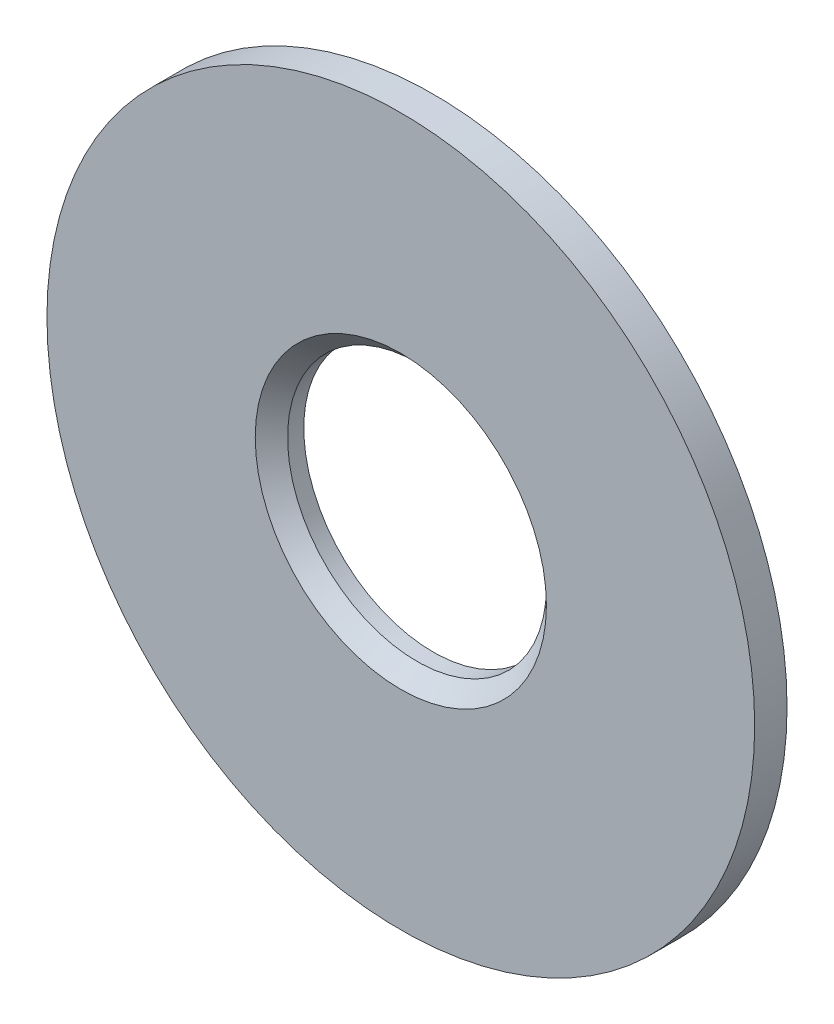
ISO-10303-21;
HEADER;
FILE_DESCRIPTION(('STEP AP214'),'2;1');
FILE_NAME('part.step','',(''),(''),'','','');
FILE_SCHEMA(('AUTOMOTIVE_DESIGN { 1 0 10303 214 1 1 1 1 }'));
ENDSEC;
DATA;
#1=APPLICATION_CONTEXT('core data for automotive mechanical design processes');
#2=APPLICATION_PROTOCOL_DEFINITION('international standard','automotive_design',2000,#1);
#3=PRODUCT_CONTEXT('',#1,'mechanical');
#4=PRODUCT('Part','Part','',(#3));
#5=PRODUCT_RELATED_PRODUCT_CATEGORY('part','',(#4));
#6=PRODUCT_DEFINITION_FORMATION('','',#4);
#7=PRODUCT_DEFINITION_CONTEXT('part definition',#1,'design');
#8=PRODUCT_DEFINITION('design','',#6,#7);
#9=PRODUCT_DEFINITION_SHAPE('','',#8);
#10=(LENGTH_UNIT() NAMED_UNIT(*) SI_UNIT(.MILLI.,.METRE.));
#11=(NAMED_UNIT(*) PLANE_ANGLE_UNIT() SI_UNIT($,.RADIAN.));
#12=(NAMED_UNIT(*) SI_UNIT($,.STERADIAN.) SOLID_ANGLE_UNIT());
#13=UNCERTAINTY_MEASURE_WITH_UNIT(LENGTH_MEASURE(1.E-05),#10,'distance_accuracy_value','');
#14=(GEOMETRIC_REPRESENTATION_CONTEXT(3) GLOBAL_UNCERTAINTY_ASSIGNED_CONTEXT((#13)) GLOBAL_UNIT_ASSIGNED_CONTEXT((#10,
#11,#12)) REPRESENTATION_CONTEXT('',''));
#15=CARTESIAN_POINT('',(0.,0.,0.));
#16=DIRECTION('',(0.,0.,1.));
#17=DIRECTION('',(1.,0.,0.));
#18=AXIS2_PLACEMENT_3D('',#15,#16,#17);
#19=CARTESIAN_POINT('',(0.,0.,4.));
#20=DIRECTION('',(0.,0.,1.));
#21=DIRECTION('',(1.00000000000002,0.,0.));
#22=AXIS2_PLACEMENT_3D('',#19,#20,#21);
#23=PLANE('',#22);
#24=CARTESIAN_POINT('',(0.,0.,4.));
#25=DIRECTION('',(0.,0.,1.));
#26=DIRECTION('',(1.00000000000002,0.,0.));
#27=AXIS2_PLACEMENT_3D('',#24,#25,#26);
#28=CIRCLE('',#27,18.);
#29=CARTESIAN_POINT('',(18.0000000000004,0.,4.));
#30=VERTEX_POINT('',#29);
#31=EDGE_CURVE('E10',#30,#30,#28,.F.);
#32=ORIENTED_EDGE('',*,*,#31,.T.);
#33=EDGE_LOOP('',(#32));
#34=FACE_BOUND('',#33,.T.);
#35=CARTESIAN_POINT('',(0.,0.,4.));
#36=DIRECTION('',(0.,0.,1.));
#37=DIRECTION('',(1.00000000000002,0.,0.));
#38=AXIS2_PLACEMENT_3D('',#35,#36,#37);
#39=CIRCLE('',#38,43.75);
#40=CARTESIAN_POINT('',(43.7500000000009,1.12410081243297E-13,4.));
#41=VERTEX_POINT('',#40);
#42=EDGE_CURVE('E43',#41,#41,#39,.T.);
#43=ORIENTED_EDGE('',*,*,#42,.T.);
#44=EDGE_LOOP('',(#43));
#45=FACE_BOUND('',#44,.T.);
#46=ADVANCED_FACE('F32',(#34,#45),#23,.T.);
#47=CARTESIAN_POINT('',(0.,0.,0.));
#48=DIRECTION('',(0.,0.,1.));
#49=DIRECTION('',(1.00000000000002,0.,0.));
#50=AXIS2_PLACEMENT_3D('',#47,#48,#49);
#51=PLANE('',#50);
#52=CARTESIAN_POINT('',(0.,0.,0.));
#53=DIRECTION('',(0.,0.,1.));
#54=DIRECTION('',(1.00000000000002,0.,0.));
#55=AXIS2_PLACEMENT_3D('',#52,#53,#54);
#56=CIRCLE('',#55,43.75);
#57=CARTESIAN_POINT('',(43.7500000000009,0.,0.));
#58=VERTEX_POINT('',#57);
#59=EDGE_CURVE('E47',#58,#58,#56,.T.);
#60=ORIENTED_EDGE('',*,*,#59,.F.);
#61=EDGE_LOOP('',(#60));
#62=FACE_BOUND('',#61,.T.);
#63=CARTESIAN_POINT('',(0.,0.,0.));
#64=DIRECTION('',(0.,0.,1.));
#65=DIRECTION('',(1.00000000000002,0.,0.));
#66=AXIS2_PLACEMENT_3D('',#63,#64,#65);
#67=CIRCLE('',#66,16.);
#68=CARTESIAN_POINT('',(16.0000000000003,0.,0.));
#69=VERTEX_POINT('',#68);
#70=EDGE_CURVE('E51',#69,#69,#67,.T.);
#71=ORIENTED_EDGE('',*,*,#70,.T.);
#72=EDGE_LOOP('',(#71));
#73=FACE_BOUND('',#72,.T.);
#74=ADVANCED_FACE('F56',(#62,#73),#51,.F.);
#75=CARTESIAN_POINT('',(0.,0.,4.));
#76=DIRECTION('',(0.,0.,-1.));
#77=DIRECTION('',(-1.00000000000002,0.,0.));
#78=AXIS2_PLACEMENT_3D('',#75,#76,#77);
#79=CYLINDRICAL_SURFACE('',#78,43.75);
#80=ORIENTED_EDGE('',*,*,#42,.F.);
#81=EDGE_LOOP('',(#80));
#82=FACE_BOUND('',#81,.T.);
#83=ORIENTED_EDGE('',*,*,#59,.T.);
#84=EDGE_LOOP('',(#83));
#85=FACE_BOUND('',#84,.T.);
#86=ADVANCED_FACE('F60',(#82,#85),#79,.T.);
#87=CARTESIAN_POINT('',(0.,0.,4.));
#88=DIRECTION('',(0.,0.,-1.));
#89=DIRECTION('',(-1.00000000000002,0.,0.));
#90=AXIS2_PLACEMENT_3D('',#87,#88,#89);
#91=CYLINDRICAL_SURFACE('',#90,16.);
#92=CARTESIAN_POINT('',(0.,0.,2.));
#93=DIRECTION('',(0.,0.,1.));
#94=DIRECTION('',(1.00000000000002,0.,0.));
#95=AXIS2_PLACEMENT_3D('',#92,#93,#94);
#96=CIRCLE('',#95,16.);
#97=CARTESIAN_POINT('',(16.0000000000003,0.,2.));
#98=VERTEX_POINT('',#97);
#99=EDGE_CURVE('E39',#98,#98,#96,.T.);
#100=ORIENTED_EDGE('',*,*,#99,.T.);
#101=EDGE_LOOP('',(#100));
#102=FACE_BOUND('',#101,.T.);
#103=ORIENTED_EDGE('',*,*,#70,.F.);
#104=EDGE_LOOP('',(#103));
#105=FACE_BOUND('',#104,.T.);
#106=ADVANCED_FACE('F58',(#102,#105),#91,.F.);
#107=CARTESIAN_POINT('',(0.,0.,2.));
#108=DIRECTION('',(0.,0.,1.));
#109=DIRECTION('',(1.00000000000002,0.,0.));
#110=AXIS2_PLACEMENT_3D('',#107,#108,#109);
#111=CONICAL_SURFACE('',#110,16.,0.785398163397449);
#112=ORIENTED_EDGE('',*,*,#31,.F.);
#113=EDGE_LOOP('',(#112));
#114=FACE_BOUND('',#113,.T.);
#115=ORIENTED_EDGE('',*,*,#99,.F.);
#116=EDGE_LOOP('',(#115));
#117=FACE_BOUND('',#116,.T.);
#118=ADVANCED_FACE('F34',(#114,#117),#111,.F.);
#119=CLOSED_SHELL('',(#46,#74,#86,#106,#118));
#120=MANIFOLD_SOLID_BREP('B2',#119);
#121=ADVANCED_BREP_SHAPE_REPRESENTATION('',(#18,#120),#14);
#122=SHAPE_DEFINITION_REPRESENTATION(#9,#121);
ENDSEC;
END-ISO-10303-21;
